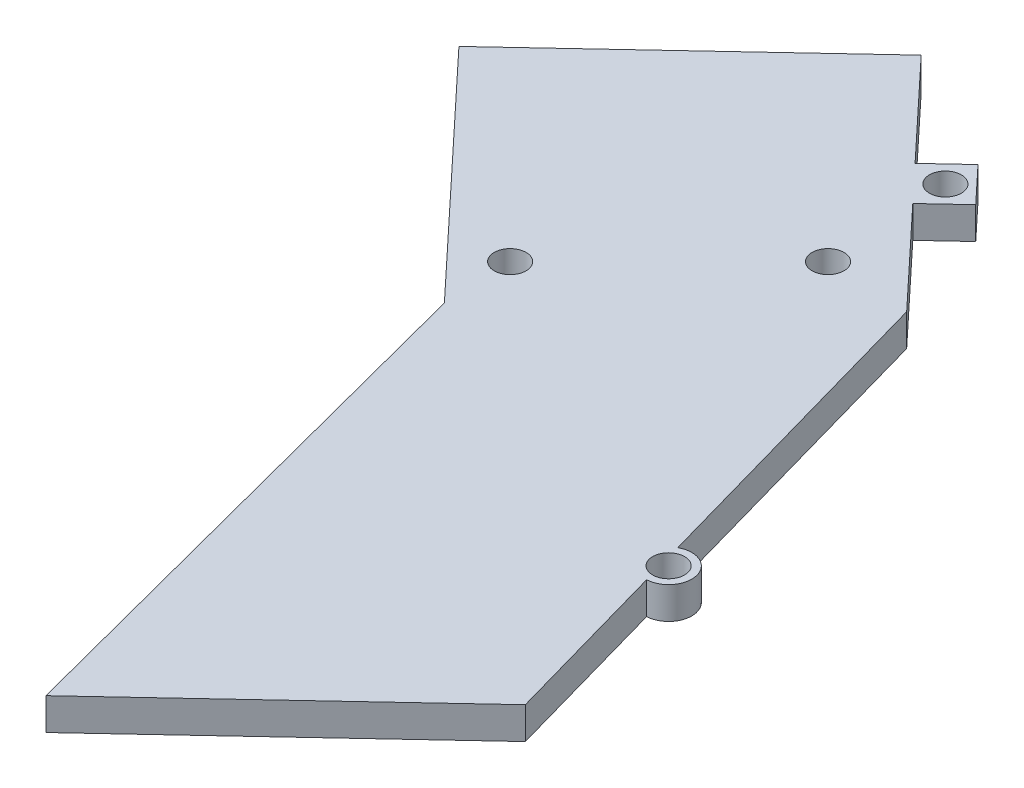
ISO-10303-21;
HEADER;
FILE_DESCRIPTION(('STEP AP214'),'2;1');
FILE_NAME('part.step','',(''),(''),'','','');
FILE_SCHEMA(('AUTOMOTIVE_DESIGN { 1 0 10303 214 1 1 1 1 }'));
ENDSEC;
DATA;
#1=APPLICATION_CONTEXT('core data for automotive mechanical design processes');
#2=APPLICATION_PROTOCOL_DEFINITION('international standard','automotive_design',2000,#1);
#3=PRODUCT_CONTEXT('',#1,'mechanical');
#4=PRODUCT('Part','Part','',(#3));
#5=PRODUCT_RELATED_PRODUCT_CATEGORY('part','',(#4));
#6=PRODUCT_DEFINITION_FORMATION('','',#4);
#7=PRODUCT_DEFINITION_CONTEXT('part definition',#1,'design');
#8=PRODUCT_DEFINITION('design','',#6,#7);
#9=PRODUCT_DEFINITION_SHAPE('','',#8);
#10=(LENGTH_UNIT() NAMED_UNIT(*) SI_UNIT(.MILLI.,.METRE.));
#11=(NAMED_UNIT(*) PLANE_ANGLE_UNIT() SI_UNIT($,.RADIAN.));
#12=(NAMED_UNIT(*) SI_UNIT($,.STERADIAN.) SOLID_ANGLE_UNIT());
#13=UNCERTAINTY_MEASURE_WITH_UNIT(LENGTH_MEASURE(1.E-05),#10,'distance_accuracy_value','');
#14=(GEOMETRIC_REPRESENTATION_CONTEXT(3) GLOBAL_UNCERTAINTY_ASSIGNED_CONTEXT((#13)) GLOBAL_UNIT_ASSIGNED_CONTEXT((#10,
#11,#12)) REPRESENTATION_CONTEXT('',''));
#15=CARTESIAN_POINT('',(0.,0.,0.));
#16=DIRECTION('',(0.,0.,1.));
#17=DIRECTION('',(1.,0.,0.));
#18=AXIS2_PLACEMENT_3D('',#15,#16,#17);
#19=CARTESIAN_POINT('',(35.3343052421428,6.35,-40.8046396074675));
#20=DIRECTION('',(0.,1.,0.));
#21=DIRECTION('',(0.,0.,1.));
#22=AXIS2_PLACEMENT_3D('',#19,#20,#21);
#23=PLANE('',#22);
#24=CARTESIAN_POINT('',(-32.8085529156341,6.35,-77.4293285985606));
#25=DIRECTION('',(0.,1.,0.));
#26=DIRECTION('',(0.,0.,1.));
#27=AXIS2_PLACEMENT_3D('',#24,#25,#26);
#28=CIRCLE('',#27,3.175);
#29=CARTESIAN_POINT('',(-32.8085529156341,6.35,-74.2543285985606));
#30=VERTEX_POINT('',#29);
#31=EDGE_CURVE('E332',#30,#30,#28,.T.);
#32=ORIENTED_EDGE('',*,*,#31,.F.);
#33=EDGE_LOOP('',(#32));
#34=FACE_BOUND('',#33,.T.);
#35=CARTESIAN_POINT('',(35.3343052421428,6.35,-40.8046396074675));
#36=DIRECTION('',(0.,1.,0.));
#37=DIRECTION('',(0.,0.,1.));
#38=AXIS2_PLACEMENT_3D('',#35,#36,#37);
#39=CIRCLE('',#38,3.175);
#40=CARTESIAN_POINT('',(35.3343052421428,6.35,-37.6296396074675));
#41=VERTEX_POINT('',#40);
#42=EDGE_CURVE('E170',#41,#41,#39,.T.);
#43=ORIENTED_EDGE('',*,*,#42,.F.);
#44=EDGE_LOOP('',(#43));
#45=FACE_BOUND('',#44,.T.);
#46=DIRECTION('',(0.252771208119309,0.,0.967526080447398));
#47=VECTOR('',#46,1.);
#48=CARTESIAN_POINT('',(-32.2270530485286,6.35,-63.769650553479));
#49=LINE('',#48,#47);
#50=CARTESIAN_POINT('',(-32.2270530485286,6.35,-63.769650553479));
#51=VERTEX_POINT('',#50);
#52=CARTESIAN_POINT('',(-4.20875199812253,6.35,43.4753050638527));
#53=VERTEX_POINT('',#52);
#54=EDGE_CURVE('E200',#51,#53,#49,.T.);
#55=ORIENTED_EDGE('',*,*,#54,.T.);
#56=DIRECTION('',(0.729853070223345,0.,-0.683604049055853));
#57=VECTOR('',#56,1.);
#58=CARTESIAN_POINT('',(45.0177469514458,6.35,-2.63182988657067));
#59=LINE('',#58,#57);
#60=CARTESIAN_POINT('',(45.0177469514458,6.35,-2.63182988657067));
#61=VERTEX_POINT('',#60);
#62=EDGE_CURVE('E112',#53,#61,#59,.T.);
#63=ORIENTED_EDGE('',*,*,#62,.T.);
#64=DIRECTION('',(-0.271368270731411,0.,-0.962475590152937));
#65=VECTOR('',#64,1.);
#66=CARTESIAN_POINT('',(45.0177469514458,6.35,-2.63182988657067));
#67=LINE('',#66,#65);
#68=CARTESIAN_POINT('',(35.5506600528873,6.35,-36.2092264818336));
#69=VERTEX_POINT('',#68);
#70=EDGE_CURVE('E237',#61,#69,#67,.T.);
#71=ORIENTED_EDGE('',*,*,#70,.T.);
#72=CARTESIAN_POINT('',(35.3343052421428,6.35,-40.8046396074675));
#73=DIRECTION('',(0.,1.,0.));
#74=DIRECTION('',(0.,0.,1.));
#75=AXIS2_PLACEMENT_3D('',#72,#73,#74);
#76=CIRCLE('',#75,4.60050336369625);
#77=CARTESIAN_POINT('',(33.1182859495221,6.35,-44.8362509099263));
#78=VERTEX_POINT('',#77);
#79=EDGE_CURVE('E257',#69,#78,#76,.T.);
#80=ORIENTED_EDGE('',*,*,#79,.T.);
#81=DIRECTION('',(-0.271368270731411,0.,-0.962475590152937));
#82=VECTOR('',#81,1.);
#83=CARTESIAN_POINT('',(33.1182859495221,6.35,-44.8362509099263));
#84=LINE('',#83,#82);
#85=CARTESIAN_POINT('',(15.243844223709,6.35,-108.232438689498));
#86=VERTEX_POINT('',#85);
#87=EDGE_CURVE('E253',#78,#86,#84,.T.);
#88=ORIENTED_EDGE('',*,*,#87,.T.);
#89=DIRECTION('',(-0.683604049055853,0.,-0.729853070223345));
#90=VECTOR('',#89,1.);
#91=CARTESIAN_POINT('',(15.243844223709,6.35,-108.232438689498));
#92=LINE('',#91,#90);
#93=CARTESIAN_POINT('',(-2.78372893497958,6.35,-127.479661751908));
#94=VERTEX_POINT('',#93);
#95=EDGE_CURVE('E256',#86,#94,#92,.T.);
#96=ORIENTED_EDGE('',*,*,#95,.T.);
#97=DIRECTION('',(0.729853070223345,0.,-0.683604049055853));
#98=VECTOR('',#97,1.);
#99=CARTESIAN_POINT('',(3.67896649570138,6.35,-133.532831827464));
#100=LINE('',#99,#98);
#101=CARTESIAN_POINT('',(3.67896649570138,6.35,-133.532831827464));
#102=VERTEX_POINT('',#101);
#103=EDGE_CURVE('E261',#94,#102,#100,.T.);
#104=ORIENTED_EDGE('',*,*,#103,.T.);
#105=DIRECTION('',(-0.683604049055853,0.,-0.729853070223345));
#106=VECTOR('',#105,1.);
#107=CARTESIAN_POINT('',(3.67896649570138,6.35,-133.532831827464));
#108=LINE('',#107,#106);
#109=CARTESIAN_POINT('',(-3.00574222456181,6.35,-140.669792455142));
#110=VERTEX_POINT('',#109);
#111=EDGE_CURVE('E268',#102,#110,#108,.T.);
#112=ORIENTED_EDGE('',*,*,#111,.T.);
#113=DIRECTION('',(-0.729853070223344,0.,0.683604049055854));
#114=VECTOR('',#113,1.);
#115=CARTESIAN_POINT('',(-3.00574222456181,6.35,-140.669792455142));
#116=LINE('',#115,#114);
#117=CARTESIAN_POINT('',(-9.46843765524275,6.35,-134.616622379586));
#118=VERTEX_POINT('',#117);
#119=EDGE_CURVE('E143',#110,#118,#116,.T.);
#120=ORIENTED_EDGE('',*,*,#119,.T.);
#121=DIRECTION('',(-0.683604049055852,0.,-0.729853070223345));
#122=VECTOR('',#121,1.);
#123=CARTESIAN_POINT('',(-9.46843765524275,6.35,-134.616622379586));
#124=LINE('',#123,#122);
#125=CARTESIAN_POINT('',(-27.4960108139313,6.35,-153.863845441997));
#126=VERTEX_POINT('',#125);
#127=EDGE_CURVE('E137',#118,#126,#124,.T.);
#128=ORIENTED_EDGE('',*,*,#127,.T.);
#129=DIRECTION('',(-0.729853070223345,0.,0.683604049055853));
#130=VECTOR('',#129,1.);
#131=CARTESIAN_POINT('',(-27.4960108139313,6.35,-153.863845441997));
#132=LINE('',#131,#130);
#133=CARTESIAN_POINT('',(-74.9669113976479,6.35,-109.401060841493));
#134=VERTEX_POINT('',#133);
#135=EDGE_CURVE('E141',#126,#134,#132,.T.);
#136=ORIENTED_EDGE('',*,*,#135,.T.);
#137=DIRECTION('',(0.683604049055853,0.,0.729853070223345));
#138=VECTOR('',#137,1.);
#139=CARTESIAN_POINT('',(-74.9669113976479,6.35,-109.401060841493));
#140=LINE('',#139,#138);
#141=EDGE_CURVE('E57',#134,#51,#140,.T.);
#142=ORIENTED_EDGE('',*,*,#141,.T.);
#143=EDGE_LOOP('',(#55,#63,#71,#80,#88,#96,#104,#112,#120,#128,#136,#142));
#144=FACE_BOUND('',#143,.T.);
#145=CARTESIAN_POINT('',(-2.89463405591554,6.35,-134.074815556906));
#146=DIRECTION('',(0.,1.,0.));
#147=DIRECTION('',(0.,0.,1.));
#148=AXIS2_PLACEMENT_3D('',#145,#146,#147);
#149=CIRCLE('',#148,3.17500000000004);
#150=CARTESIAN_POINT('',(-2.89463405591554,6.35,-130.899815556906));
#151=VERTEX_POINT('',#150);
#152=EDGE_CURVE('E340',#151,#151,#149,.T.);
#153=ORIENTED_EDGE('',*,*,#152,.F.);
#154=EDGE_LOOP('',(#153));
#155=FACE_BOUND('',#154,.T.);
#156=CARTESIAN_POINT('',(-1.19998114192617,6.35,-109.041759799377));
#157=DIRECTION('',(0.,1.,0.));
#158=DIRECTION('',(0.,0.,1.));
#159=AXIS2_PLACEMENT_3D('',#156,#157,#158);
#160=CIRCLE('',#159,3.175);
#161=CARTESIAN_POINT('',(-1.19998114192617,6.35,-105.866759799377));
#162=VERTEX_POINT('',#161);
#163=EDGE_CURVE('E321',#162,#162,#160,.T.);
#164=ORIENTED_EDGE('',*,*,#163,.F.);
#165=EDGE_LOOP('',(#164));
#166=FACE_BOUND('',#165,.T.);
#167=ADVANCED_FACE('F39',(#34,#45,#144,#155,#166),#23,.T.);
#168=CARTESIAN_POINT('',(35.3343052421428,0.,-40.8046396074675));
#169=DIRECTION('',(0.,1.,0.));
#170=DIRECTION('',(0.,0.,1.));
#171=AXIS2_PLACEMENT_3D('',#168,#169,#170);
#172=PLANE('',#171);
#173=DIRECTION('',(0.252771208119309,0.,0.967526080447398));
#174=VECTOR('',#173,1.);
#175=CARTESIAN_POINT('',(-32.2270530485286,0.,-63.769650553479));
#176=LINE('',#175,#174);
#177=CARTESIAN_POINT('',(-32.2270530485286,0.,-63.769650553479));
#178=VERTEX_POINT('',#177);
#179=CARTESIAN_POINT('',(-4.20875199812253,0.,43.4753050638527));
#180=VERTEX_POINT('',#179);
#181=EDGE_CURVE('E165',#178,#180,#176,.T.);
#182=ORIENTED_EDGE('',*,*,#181,.F.);
#183=DIRECTION('',(0.683604049055853,0.,0.729853070223345));
#184=VECTOR('',#183,1.);
#185=CARTESIAN_POINT('',(-74.9669113976479,0.,-109.401060841493));
#186=LINE('',#185,#184);
#187=CARTESIAN_POINT('',(-74.9669113976479,0.,-109.401060841493));
#188=VERTEX_POINT('',#187);
#189=EDGE_CURVE('E104',#188,#178,#186,.T.);
#190=ORIENTED_EDGE('',*,*,#189,.F.);
#191=DIRECTION('',(-0.729853070223345,0.,0.683604049055853));
#192=VECTOR('',#191,1.);
#193=CARTESIAN_POINT('',(-27.4960108139313,0.,-153.863845441997));
#194=LINE('',#193,#192);
#195=CARTESIAN_POINT('',(-27.4960108139313,0.,-153.863845441997));
#196=VERTEX_POINT('',#195);
#197=EDGE_CURVE('E98',#196,#188,#194,.T.);
#198=ORIENTED_EDGE('',*,*,#197,.F.);
#199=DIRECTION('',(-0.683604049055852,0.,-0.729853070223345));
#200=VECTOR('',#199,1.);
#201=CARTESIAN_POINT('',(-9.46843765524275,0.,-134.616622379586));
#202=LINE('',#201,#200);
#203=CARTESIAN_POINT('',(-9.46843765524275,0.,-134.616622379586));
#204=VERTEX_POINT('',#203);
#205=EDGE_CURVE('E152',#204,#196,#202,.T.);
#206=ORIENTED_EDGE('',*,*,#205,.F.);
#207=DIRECTION('',(-0.729853070223344,0.,0.683604049055854));
#208=VECTOR('',#207,1.);
#209=CARTESIAN_POINT('',(-3.00574222456181,0.,-140.669792455142));
#210=LINE('',#209,#208);
#211=CARTESIAN_POINT('',(-3.00574222456181,0.,-140.669792455142));
#212=VERTEX_POINT('',#211);
#213=EDGE_CURVE('E191',#212,#204,#210,.T.);
#214=ORIENTED_EDGE('',*,*,#213,.F.);
#215=DIRECTION('',(-0.683604049055853,0.,-0.729853070223345));
#216=VECTOR('',#215,1.);
#217=CARTESIAN_POINT('',(3.67896649570138,0.,-133.532831827464));
#218=LINE('',#217,#216);
#219=CARTESIAN_POINT('',(3.67896649570138,0.,-133.532831827464));
#220=VERTEX_POINT('',#219);
#221=EDGE_CURVE('E188',#220,#212,#218,.T.);
#222=ORIENTED_EDGE('',*,*,#221,.F.);
#223=DIRECTION('',(0.729853070223345,0.,-0.683604049055853));
#224=VECTOR('',#223,1.);
#225=CARTESIAN_POINT('',(3.67896649570138,0.,-133.532831827464));
#226=LINE('',#225,#224);
#227=CARTESIAN_POINT('',(-2.78372893497958,0.,-127.479661751908));
#228=VERTEX_POINT('',#227);
#229=EDGE_CURVE('E185',#228,#220,#226,.T.);
#230=ORIENTED_EDGE('',*,*,#229,.F.);
#231=DIRECTION('',(-0.683604049055853,0.,-0.729853070223345));
#232=VECTOR('',#231,1.);
#233=CARTESIAN_POINT('',(15.243844223709,0.,-108.232438689498));
#234=LINE('',#233,#232);
#235=CARTESIAN_POINT('',(15.243844223709,0.,-108.232438689498));
#236=VERTEX_POINT('',#235);
#237=EDGE_CURVE('E182',#236,#228,#234,.T.);
#238=ORIENTED_EDGE('',*,*,#237,.F.);
#239=DIRECTION('',(-0.271368270731411,0.,-0.962475590152937));
#240=VECTOR('',#239,1.);
#241=CARTESIAN_POINT('',(33.1182859495221,0.,-44.8362509099263));
#242=LINE('',#241,#240);
#243=CARTESIAN_POINT('',(33.1182859495221,0.,-44.8362509099263));
#244=VERTEX_POINT('',#243);
#245=EDGE_CURVE('E179',#244,#236,#242,.T.);
#246=ORIENTED_EDGE('',*,*,#245,.F.);
#247=CARTESIAN_POINT('',(35.3343052421428,0.,-40.8046396074675));
#248=DIRECTION('',(0.,1.,0.));
#249=DIRECTION('',(0.,0.,1.));
#250=AXIS2_PLACEMENT_3D('',#247,#248,#249);
#251=CIRCLE('',#250,4.60050336369625);
#252=CARTESIAN_POINT('',(35.5506600528873,0.,-36.2092264818336));
#253=VERTEX_POINT('',#252);
#254=EDGE_CURVE('E176',#253,#244,#251,.T.);
#255=ORIENTED_EDGE('',*,*,#254,.F.);
#256=DIRECTION('',(-0.271368270731411,0.,-0.962475590152937));
#257=VECTOR('',#256,1.);
#258=CARTESIAN_POINT('',(45.0177469514458,0.,-2.63182988657067));
#259=LINE('',#258,#257);
#260=CARTESIAN_POINT('',(45.0177469514458,0.,-2.63182988657067));
#261=VERTEX_POINT('',#260);
#262=EDGE_CURVE('E173',#261,#253,#259,.T.);
#263=ORIENTED_EDGE('',*,*,#262,.F.);
#264=DIRECTION('',(0.729853070223345,0.,-0.683604049055853));
#265=VECTOR('',#264,1.);
#266=CARTESIAN_POINT('',(45.0177469514458,0.,-2.63182988657067));
#267=LINE('',#266,#265);
#268=EDGE_CURVE('E169',#180,#261,#267,.T.);
#269=ORIENTED_EDGE('',*,*,#268,.F.);
#270=EDGE_LOOP('',(#182,#190,#198,#206,#214,#222,#230,#238,#246,#255,#263,#269));
#271=FACE_BOUND('',#270,.T.);
#272=CARTESIAN_POINT('',(35.3343052421428,0.,-40.8046396074675));
#273=DIRECTION('',(0.,1.,0.));
#274=DIRECTION('',(0.,0.,1.));
#275=AXIS2_PLACEMENT_3D('',#272,#273,#274);
#276=CIRCLE('',#275,3.175);
#277=CARTESIAN_POINT('',(35.3343052421428,0.,-37.6296396074675));
#278=VERTEX_POINT('',#277);
#279=EDGE_CURVE('E344',#278,#278,#276,.T.);
#280=ORIENTED_EDGE('',*,*,#279,.T.);
#281=EDGE_LOOP('',(#280));
#282=FACE_BOUND('',#281,.T.);
#283=CARTESIAN_POINT('',(-2.89463405591554,0.,-134.074815556906));
#284=DIRECTION('',(0.,1.,0.));
#285=DIRECTION('',(0.,0.,1.));
#286=AXIS2_PLACEMENT_3D('',#283,#284,#285);
#287=CIRCLE('',#286,3.17500000000004);
#288=CARTESIAN_POINT('',(-2.89463405591554,0.,-130.899815556906));
#289=VERTEX_POINT('',#288);
#290=EDGE_CURVE('E336',#289,#289,#287,.T.);
#291=ORIENTED_EDGE('',*,*,#290,.T.);
#292=EDGE_LOOP('',(#291));
#293=FACE_BOUND('',#292,.T.);
#294=CARTESIAN_POINT('',(-32.8085529156341,0.,-77.4293285985606));
#295=DIRECTION('',(0.,1.,0.));
#296=DIRECTION('',(0.,0.,1.));
#297=AXIS2_PLACEMENT_3D('',#294,#295,#296);
#298=CIRCLE('',#297,3.175);
#299=CARTESIAN_POINT('',(-32.8085529156341,0.,-74.2543285985606));
#300=VERTEX_POINT('',#299);
#301=EDGE_CURVE('E329',#300,#300,#298,.T.);
#302=ORIENTED_EDGE('',*,*,#301,.T.);
#303=EDGE_LOOP('',(#302));
#304=FACE_BOUND('',#303,.T.);
#305=CARTESIAN_POINT('',(-1.19998114192617,0.,-109.041759799377));
#306=DIRECTION('',(0.,1.,0.));
#307=DIRECTION('',(0.,0.,1.));
#308=AXIS2_PLACEMENT_3D('',#305,#306,#307);
#309=CIRCLE('',#308,3.175);
#310=CARTESIAN_POINT('',(-1.19998114192617,0.,-105.866759799377));
#311=VERTEX_POINT('',#310);
#312=EDGE_CURVE('E324',#311,#311,#309,.T.);
#313=ORIENTED_EDGE('',*,*,#312,.T.);
#314=EDGE_LOOP('',(#313));
#315=FACE_BOUND('',#314,.T.);
#316=ADVANCED_FACE('F241',(#271,#282,#293,#304,#315),#172,.F.);
#317=CARTESIAN_POINT('',(-32.2270530485286,6.35,-63.769650553479));
#318=DIRECTION('',(0.967526080447398,0.,-0.252771208119309));
#319=DIRECTION('',(-0.252771208119309,0.,-0.967526080447398));
#320=AXIS2_PLACEMENT_3D('',#317,#318,#319);
#321=PLANE('',#320);
#322=ORIENTED_EDGE('',*,*,#181,.T.);
#323=DIRECTION('',(0.,-1.,0.));
#324=VECTOR('',#323,1.);
#325=CARTESIAN_POINT('',(-4.20875199812253,6.35,43.4753050638527));
#326=LINE('',#325,#324);
#327=EDGE_CURVE('E11',#53,#180,#326,.T.);
#328=ORIENTED_EDGE('',*,*,#327,.F.);
#329=ORIENTED_EDGE('',*,*,#54,.F.);
#330=DIRECTION('',(0.,-1.,0.));
#331=VECTOR('',#330,1.);
#332=CARTESIAN_POINT('',(-32.2270530485286,6.35,-63.769650553479));
#333=LINE('',#332,#331);
#334=EDGE_CURVE('E161',#51,#178,#333,.T.);
#335=ORIENTED_EDGE('',*,*,#334,.T.);
#336=EDGE_LOOP('',(#322,#328,#329,#335));
#337=FACE_BOUND('',#336,.T.);
#338=ADVANCED_FACE('F41',(#337),#321,.F.);
#339=CARTESIAN_POINT('',(45.0177469514458,6.35,-2.63182988657067));
#340=DIRECTION('',(-0.683604049055853,0.,-0.729853070223345));
#341=DIRECTION('',(-0.729853070223345,0.,0.683604049055853));
#342=AXIS2_PLACEMENT_3D('',#339,#340,#341);
#343=PLANE('',#342);
#344=ORIENTED_EDGE('',*,*,#268,.T.);
#345=DIRECTION('',(0.,-1.,0.));
#346=VECTOR('',#345,1.);
#347=CARTESIAN_POINT('',(45.0177469514458,6.35,-2.63182988657067));
#348=LINE('',#347,#346);
#349=EDGE_CURVE('E49',#61,#261,#348,.T.);
#350=ORIENTED_EDGE('',*,*,#349,.F.);
#351=ORIENTED_EDGE('',*,*,#62,.F.);
#352=ORIENTED_EDGE('',*,*,#327,.T.);
#353=EDGE_LOOP('',(#344,#350,#351,#352));
#354=FACE_BOUND('',#353,.T.);
#355=ADVANCED_FACE('F460',(#354),#343,.F.);
#356=CARTESIAN_POINT('',(45.0177469514458,6.35,-2.63182988657067));
#357=DIRECTION('',(-0.962475590152937,0.,0.271368270731411));
#358=DIRECTION('',(0.271368270731411,0.,0.962475590152937));
#359=AXIS2_PLACEMENT_3D('',#356,#357,#358);
#360=PLANE('',#359);
#361=ORIENTED_EDGE('',*,*,#262,.T.);
#362=DIRECTION('',(0.,-1.,0.));
#363=VECTOR('',#362,1.);
#364=CARTESIAN_POINT('',(35.5506600528873,6.35,-36.2092264818336));
#365=LINE('',#364,#363);
#366=EDGE_CURVE('E227',#69,#253,#365,.T.);
#367=ORIENTED_EDGE('',*,*,#366,.F.);
#368=ORIENTED_EDGE('',*,*,#70,.F.);
#369=ORIENTED_EDGE('',*,*,#349,.T.);
#370=EDGE_LOOP('',(#361,#367,#368,#369));
#371=FACE_BOUND('',#370,.T.);
#372=ADVANCED_FACE('F235',(#371),#360,.F.);
#373=CARTESIAN_POINT('',(35.3343052421428,6.35,-40.8046396074675));
#374=DIRECTION('',(0.,-1.,0.));
#375=DIRECTION('',(0.,0.,-1.));
#376=AXIS2_PLACEMENT_3D('',#373,#374,#375);
#377=CYLINDRICAL_SURFACE('',#376,4.60050336369625);
#378=ORIENTED_EDGE('',*,*,#254,.T.);
#379=DIRECTION('',(0.,-1.,0.));
#380=VECTOR('',#379,1.);
#381=CARTESIAN_POINT('',(33.1182859495221,6.35,-44.8362509099263));
#382=LINE('',#381,#380);
#383=EDGE_CURVE('E223',#78,#244,#382,.T.);
#384=ORIENTED_EDGE('',*,*,#383,.F.);
#385=ORIENTED_EDGE('',*,*,#79,.F.);
#386=ORIENTED_EDGE('',*,*,#366,.T.);
#387=EDGE_LOOP('',(#378,#384,#385,#386));
#388=FACE_BOUND('',#387,.T.);
#389=ADVANCED_FACE('F247',(#388),#377,.T.);
#390=CARTESIAN_POINT('',(33.1182859495221,6.35,-44.8362509099263));
#391=DIRECTION('',(-0.962475590152937,0.,0.27136827073141));
#392=DIRECTION('',(0.271368270731411,0.,0.962475590152937));
#393=AXIS2_PLACEMENT_3D('',#390,#391,#392);
#394=PLANE('',#393);
#395=ORIENTED_EDGE('',*,*,#245,.T.);
#396=DIRECTION('',(0.,-1.,0.));
#397=VECTOR('',#396,1.);
#398=CARTESIAN_POINT('',(15.243844223709,6.35,-108.232438689498));
#399=LINE('',#398,#397);
#400=EDGE_CURVE('E219',#86,#236,#399,.T.);
#401=ORIENTED_EDGE('',*,*,#400,.F.);
#402=ORIENTED_EDGE('',*,*,#87,.F.);
#403=ORIENTED_EDGE('',*,*,#383,.T.);
#404=EDGE_LOOP('',(#395,#401,#402,#403));
#405=FACE_BOUND('',#404,.T.);
#406=ADVANCED_FACE('F251',(#405),#394,.F.);
#407=CARTESIAN_POINT('',(15.243844223709,6.35,-108.232438689498));
#408=DIRECTION('',(-0.729853070223345,0.,0.683604049055853));
#409=DIRECTION('',(0.683604049055853,0.,0.729853070223345));
#410=AXIS2_PLACEMENT_3D('',#407,#408,#409);
#411=PLANE('',#410);
#412=ORIENTED_EDGE('',*,*,#237,.T.);
#413=DIRECTION('',(0.,-1.,0.));
#414=VECTOR('',#413,1.);
#415=CARTESIAN_POINT('',(-2.78372893497958,6.35,-127.479661751908));
#416=LINE('',#415,#414);
#417=EDGE_CURVE('E215',#94,#228,#416,.T.);
#418=ORIENTED_EDGE('',*,*,#417,.F.);
#419=ORIENTED_EDGE('',*,*,#95,.F.);
#420=ORIENTED_EDGE('',*,*,#400,.T.);
#421=EDGE_LOOP('',(#412,#418,#419,#420));
#422=FACE_BOUND('',#421,.T.);
#423=ADVANCED_FACE('F425',(#422),#411,.F.);
#424=CARTESIAN_POINT('',(3.67896649570138,6.35,-133.532831827464));
#425=DIRECTION('',(-0.683604049055853,0.,-0.729853070223345));
#426=DIRECTION('',(-0.729853070223345,0.,0.683604049055853));
#427=AXIS2_PLACEMENT_3D('',#424,#425,#426);
#428=PLANE('',#427);
#429=ORIENTED_EDGE('',*,*,#229,.T.);
#430=DIRECTION('',(0.,-1.,0.));
#431=VECTOR('',#430,1.);
#432=CARTESIAN_POINT('',(3.67896649570138,6.35,-133.532831827464));
#433=LINE('',#432,#431);
#434=EDGE_CURVE('E211',#102,#220,#433,.T.);
#435=ORIENTED_EDGE('',*,*,#434,.F.);
#436=ORIENTED_EDGE('',*,*,#103,.F.);
#437=ORIENTED_EDGE('',*,*,#417,.T.);
#438=EDGE_LOOP('',(#429,#435,#436,#437));
#439=FACE_BOUND('',#438,.T.);
#440=ADVANCED_FACE('F416',(#439),#428,.F.);
#441=CARTESIAN_POINT('',(3.67896649570138,6.35,-133.532831827464));
#442=DIRECTION('',(-0.729853070223345,0.,0.683604049055853));
#443=DIRECTION('',(0.683604049055853,0.,0.729853070223345));
#444=AXIS2_PLACEMENT_3D('',#441,#442,#443);
#445=PLANE('',#444);
#446=ORIENTED_EDGE('',*,*,#221,.T.);
#447=DIRECTION('',(0.,-1.,0.));
#448=VECTOR('',#447,1.);
#449=CARTESIAN_POINT('',(-3.00574222456181,6.35,-140.669792455142));
#450=LINE('',#449,#448);
#451=EDGE_CURVE('E207',#110,#212,#450,.T.);
#452=ORIENTED_EDGE('',*,*,#451,.F.);
#453=ORIENTED_EDGE('',*,*,#111,.F.);
#454=ORIENTED_EDGE('',*,*,#434,.T.);
#455=EDGE_LOOP('',(#446,#452,#453,#454));
#456=FACE_BOUND('',#455,.T.);
#457=ADVANCED_FACE('F276',(#456),#445,.F.);
#458=CARTESIAN_POINT('',(-3.00574222456181,6.35,-140.669792455142));
#459=DIRECTION('',(0.683604049055854,0.,0.729853070223344));
#460=DIRECTION('',(0.729853070223344,0.,-0.683604049055854));
#461=AXIS2_PLACEMENT_3D('',#458,#459,#460);
#462=PLANE('',#461);
#463=ORIENTED_EDGE('',*,*,#213,.T.);
#464=DIRECTION('',(0.,-1.,0.));
#465=VECTOR('',#464,1.);
#466=CARTESIAN_POINT('',(-9.46843765524275,6.35,-134.616622379586));
#467=LINE('',#466,#465);
#468=EDGE_CURVE('E154',#118,#204,#467,.T.);
#469=ORIENTED_EDGE('',*,*,#468,.F.);
#470=ORIENTED_EDGE('',*,*,#119,.F.);
#471=ORIENTED_EDGE('',*,*,#451,.T.);
#472=EDGE_LOOP('',(#463,#469,#470,#471));
#473=FACE_BOUND('',#472,.T.);
#474=ADVANCED_FACE('F280',(#473),#462,.F.);
#475=CARTESIAN_POINT('',(-9.46843765524275,6.35,-134.616622379586));
#476=DIRECTION('',(-0.729853070223345,0.,0.683604049055852));
#477=DIRECTION('',(0.683604049055852,0.,0.729853070223345));
#478=AXIS2_PLACEMENT_3D('',#475,#476,#477);
#479=PLANE('',#478);
#480=ORIENTED_EDGE('',*,*,#205,.T.);
#481=DIRECTION('',(0.,-1.,0.));
#482=VECTOR('',#481,1.);
#483=CARTESIAN_POINT('',(-27.4960108139313,6.35,-153.863845441997));
#484=LINE('',#483,#482);
#485=EDGE_CURVE('E149',#126,#196,#484,.T.);
#486=ORIENTED_EDGE('',*,*,#485,.F.);
#487=ORIENTED_EDGE('',*,*,#127,.F.);
#488=ORIENTED_EDGE('',*,*,#468,.T.);
#489=EDGE_LOOP('',(#480,#486,#487,#488));
#490=FACE_BOUND('',#489,.T.);
#491=ADVANCED_FACE('F150',(#490),#479,.F.);
#492=CARTESIAN_POINT('',(-27.4960108139313,6.35,-153.863845441997));
#493=DIRECTION('',(0.683604049055853,0.,0.729853070223345));
#494=DIRECTION('',(0.729853070223345,0.,-0.683604049055853));
#495=AXIS2_PLACEMENT_3D('',#492,#493,#494);
#496=PLANE('',#495);
#497=ORIENTED_EDGE('',*,*,#197,.T.);
#498=DIRECTION('',(0.,-1.,0.));
#499=VECTOR('',#498,1.);
#500=CARTESIAN_POINT('',(-74.9669113976479,6.35,-109.401060841493));
#501=LINE('',#500,#499);
#502=EDGE_CURVE('E155',#134,#188,#501,.T.);
#503=ORIENTED_EDGE('',*,*,#502,.F.);
#504=ORIENTED_EDGE('',*,*,#135,.F.);
#505=ORIENTED_EDGE('',*,*,#485,.T.);
#506=EDGE_LOOP('',(#497,#503,#504,#505));
#507=FACE_BOUND('',#506,.T.);
#508=ADVANCED_FACE('F157',(#507),#496,.F.);
#509=CARTESIAN_POINT('',(-74.9669113976479,6.35,-109.401060841493));
#510=DIRECTION('',(0.729853070223345,0.,-0.683604049055853));
#511=DIRECTION('',(-0.683604049055853,0.,-0.729853070223345));
#512=AXIS2_PLACEMENT_3D('',#509,#510,#511);
#513=PLANE('',#512);
#514=ORIENTED_EDGE('',*,*,#189,.T.);
#515=ORIENTED_EDGE('',*,*,#334,.F.);
#516=ORIENTED_EDGE('',*,*,#141,.F.);
#517=ORIENTED_EDGE('',*,*,#502,.T.);
#518=EDGE_LOOP('',(#514,#515,#516,#517));
#519=FACE_BOUND('',#518,.T.);
#520=ADVANCED_FACE('F284',(#519),#513,.F.);
#521=CARTESIAN_POINT('',(35.3343052421428,6.35,-40.8046396074675));
#522=DIRECTION('',(0.,-1.,0.));
#523=DIRECTION('',(0.,0.,-1.));
#524=AXIS2_PLACEMENT_3D('',#521,#522,#523);
#525=CYLINDRICAL_SURFACE('',#524,3.175);
#526=ORIENTED_EDGE('',*,*,#42,.T.);
#527=EDGE_LOOP('',(#526));
#528=FACE_BOUND('',#527,.T.);
#529=ORIENTED_EDGE('',*,*,#279,.F.);
#530=EDGE_LOOP('',(#529));
#531=FACE_BOUND('',#530,.T.);
#532=ADVANCED_FACE('F286',(#528,#531),#525,.F.);
#533=CARTESIAN_POINT('',(-2.89463405591554,6.35,-134.074815556906));
#534=DIRECTION('',(0.,-1.,0.));
#535=DIRECTION('',(0.,0.,-1.));
#536=AXIS2_PLACEMENT_3D('',#533,#534,#535);
#537=CYLINDRICAL_SURFACE('',#536,3.17500000000004);
#538=ORIENTED_EDGE('',*,*,#152,.T.);
#539=EDGE_LOOP('',(#538));
#540=FACE_BOUND('',#539,.T.);
#541=ORIENTED_EDGE('',*,*,#290,.F.);
#542=EDGE_LOOP('',(#541));
#543=FACE_BOUND('',#542,.T.);
#544=ADVANCED_FACE('F292',(#540,#543),#537,.F.);
#545=CARTESIAN_POINT('',(-32.8085529156341,6.35,-77.4293285985606));
#546=DIRECTION('',(0.,-1.,0.));
#547=DIRECTION('',(0.,0.,-1.));
#548=AXIS2_PLACEMENT_3D('',#545,#546,#547);
#549=CYLINDRICAL_SURFACE('',#548,3.175);
#550=ORIENTED_EDGE('',*,*,#31,.T.);
#551=EDGE_LOOP('',(#550));
#552=FACE_BOUND('',#551,.T.);
#553=ORIENTED_EDGE('',*,*,#301,.F.);
#554=EDGE_LOOP('',(#553));
#555=FACE_BOUND('',#554,.T.);
#556=ADVANCED_FACE('F308',(#552,#555),#549,.F.);
#557=CARTESIAN_POINT('',(-1.19998114192617,6.35,-109.041759799377));
#558=DIRECTION('',(0.,-1.,0.));
#559=DIRECTION('',(0.,0.,-1.));
#560=AXIS2_PLACEMENT_3D('',#557,#558,#559);
#561=CYLINDRICAL_SURFACE('',#560,3.175);
#562=ORIENTED_EDGE('',*,*,#163,.T.);
#563=EDGE_LOOP('',(#562));
#564=FACE_BOUND('',#563,.T.);
#565=ORIENTED_EDGE('',*,*,#312,.F.);
#566=EDGE_LOOP('',(#565));
#567=FACE_BOUND('',#566,.T.);
#568=ADVANCED_FACE('F312',(#564,#567),#561,.F.);
#569=CLOSED_SHELL('',(#167,#316,#338,#355,#372,#389,#406,#423,#440,#457,#474,#491,#508,#520,
#532,#544,#556,#568));
#570=MANIFOLD_SOLID_BREP('B2',#569);
#571=ADVANCED_BREP_SHAPE_REPRESENTATION('',(#18,#570),#14);
#572=SHAPE_DEFINITION_REPRESENTATION(#9,#571);
ENDSEC;
END-ISO-10303-21;
